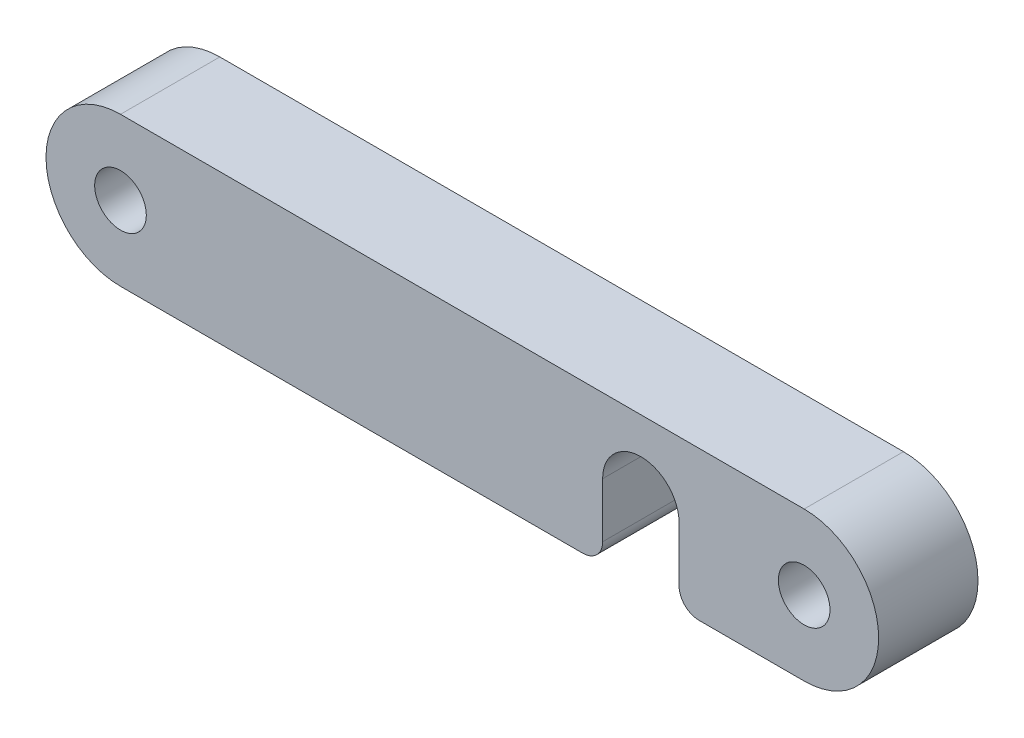
ISO-10303-21;
HEADER;
FILE_DESCRIPTION(('STEP AP214'),'2;1');
FILE_NAME('part.step','',(''),(''),'','','');
FILE_SCHEMA(('AUTOMOTIVE_DESIGN { 1 0 10303 214 1 1 1 1 }'));
ENDSEC;
DATA;
#1=APPLICATION_CONTEXT('core data for automotive mechanical design processes');
#2=APPLICATION_PROTOCOL_DEFINITION('international standard','automotive_design',2000,#1);
#3=PRODUCT_CONTEXT('',#1,'mechanical');
#4=PRODUCT('Part','Part','',(#3));
#5=PRODUCT_RELATED_PRODUCT_CATEGORY('part','',(#4));
#6=PRODUCT_DEFINITION_FORMATION('','',#4);
#7=PRODUCT_DEFINITION_CONTEXT('part definition',#1,'design');
#8=PRODUCT_DEFINITION('design','',#6,#7);
#9=PRODUCT_DEFINITION_SHAPE('','',#8);
#10=(LENGTH_UNIT() NAMED_UNIT(*) SI_UNIT(.MILLI.,.METRE.));
#11=(NAMED_UNIT(*) PLANE_ANGLE_UNIT() SI_UNIT($,.RADIAN.));
#12=(NAMED_UNIT(*) SI_UNIT($,.STERADIAN.) SOLID_ANGLE_UNIT());
#13=UNCERTAINTY_MEASURE_WITH_UNIT(LENGTH_MEASURE(1.E-05),#10,'distance_accuracy_value','');
#14=(GEOMETRIC_REPRESENTATION_CONTEXT(3) GLOBAL_UNCERTAINTY_ASSIGNED_CONTEXT((#13)) GLOBAL_UNIT_ASSIGNED_CONTEXT((#10,
#11,#12)) REPRESENTATION_CONTEXT('',''));
#15=CARTESIAN_POINT('',(0.,0.,0.));
#16=DIRECTION('',(0.,0.,1.));
#17=DIRECTION('',(1.,0.,0.));
#18=AXIS2_PLACEMENT_3D('',#15,#16,#17);
#19=CARTESIAN_POINT('',(-21.851501763,-4.7625,6.35));
#20=DIRECTION('',(0.,1.,0.));
#21=DIRECTION('',(0.,0.,1.));
#22=AXIS2_PLACEMENT_3D('',#19,#20,#21);
#23=PLANE('',#22);
#24=DIRECTION('',(0.,0.,-1.));
#25=VECTOR('',#24,1.);
#26=CARTESIAN_POINT('',(15.1269520910022,-4.7625,6.35));
#27=LINE('',#26,#25);
#28=CARTESIAN_POINT('',(15.1269520910022,-4.7625,6.35));
#29=VERTEX_POINT('',#28);
#30=CARTESIAN_POINT('',(15.1269520910022,-4.7625,0.));
#31=VERTEX_POINT('',#30);
#32=EDGE_CURVE('E164',#29,#31,#27,.T.);
#33=ORIENTED_EDGE('',*,*,#32,.T.);
#34=DIRECTION('',(1.,0.,0.));
#35=VECTOR('',#34,1.);
#36=CARTESIAN_POINT('',(-21.851501763,-4.7625,0.));
#37=LINE('',#36,#35);
#38=CARTESIAN_POINT('',(21.851501763,-4.7625,0.));
#39=VERTEX_POINT('',#38);
#40=EDGE_CURVE('E193',#31,#39,#37,.T.);
#41=ORIENTED_EDGE('',*,*,#40,.T.);
#42=DIRECTION('',(0.,0.,-1.));
#43=VECTOR('',#42,1.);
#44=CARTESIAN_POINT('',(21.851501763,-4.7625,6.35));
#45=LINE('',#44,#43);
#46=CARTESIAN_POINT('',(21.851501763,-4.7625,6.35));
#47=VERTEX_POINT('',#46);
#48=EDGE_CURVE('E43',#47,#39,#45,.T.);
#49=ORIENTED_EDGE('',*,*,#48,.F.);
#50=DIRECTION('',(1.,0.,0.));
#51=VECTOR('',#50,1.);
#52=CARTESIAN_POINT('',(-21.851501763,-4.7625,6.35));
#53=LINE('',#52,#51);
#54=EDGE_CURVE('E185',#29,#47,#53,.T.);
#55=ORIENTED_EDGE('',*,*,#54,.F.);
#56=EDGE_LOOP('',(#33,#41,#49,#55));
#57=FACE_BOUND('',#56,.T.);
#58=ADVANCED_FACE('F35',(#57),#23,.F.);
#59=CARTESIAN_POINT('',(-21.851501763,0.,6.35));
#60=DIRECTION('',(0.,0.,1.));
#61=DIRECTION('',(1.,0.,0.));
#62=AXIS2_PLACEMENT_3D('',#59,#60,#61);
#63=PLANE('',#62);
#64=CARTESIAN_POINT('',(7.69945209100216,-3.4925,6.35));
#65=DIRECTION('',(0.,0.,1.));
#66=DIRECTION('',(-1.,0.,0.));
#67=AXIS2_PLACEMENT_3D('',#64,#65,#66);
#68=CIRCLE('',#67,1.27);
#69=CARTESIAN_POINT('',(7.69945209100216,-4.7625,6.35));
#70=VERTEX_POINT('',#69);
#71=CARTESIAN_POINT('',(8.96945209100216,-3.4925,6.35));
#72=VERTEX_POINT('',#71);
#73=EDGE_CURVE('E125',#70,#72,#68,.T.);
#74=ORIENTED_EDGE('',*,*,#73,.T.);
#75=DIRECTION('',(0.,1.,0.));
#76=VECTOR('',#75,1.);
#77=CARTESIAN_POINT('',(8.96945209100216,-1.42681005899092E-13,6.35));
#78=LINE('',#77,#76);
#79=CARTESIAN_POINT('',(8.96945209100216,-1.42681005899092E-13,6.35));
#80=VERTEX_POINT('',#79);
#81=EDGE_CURVE('E135',#72,#80,#78,.T.);
#82=ORIENTED_EDGE('',*,*,#81,.T.);
#83=CARTESIAN_POINT('',(11.4132020910022,-1.42681005899092E-13,6.35));
#84=DIRECTION('',(0.,0.,-1.));
#85=DIRECTION('',(-1.,0.,0.));
#86=AXIS2_PLACEMENT_3D('',#83,#84,#85);
#87=CIRCLE('',#86,2.44375);
#88=CARTESIAN_POINT('',(13.8569520910022,-1.42381732837551E-13,6.35));
#89=VERTEX_POINT('',#88);
#90=EDGE_CURVE('E139',#80,#89,#87,.T.);
#91=ORIENTED_EDGE('',*,*,#90,.T.);
#92=DIRECTION('',(0.,-1.,0.));
#93=VECTOR('',#92,1.);
#94=CARTESIAN_POINT('',(13.8569520910022,-3.4925,6.35));
#95=LINE('',#94,#93);
#96=CARTESIAN_POINT('',(13.8569520910022,-3.4925,6.35));
#97=VERTEX_POINT('',#96);
#98=EDGE_CURVE('E148',#89,#97,#95,.T.);
#99=ORIENTED_EDGE('',*,*,#98,.T.);
#100=CARTESIAN_POINT('',(15.1269520910022,-3.4925,6.35));
#101=DIRECTION('',(0.,0.,1.));
#102=DIRECTION('',(-1.,0.,0.));
#103=AXIS2_PLACEMENT_3D('',#100,#101,#102);
#104=CIRCLE('',#103,1.27);
#105=EDGE_CURVE('E132',#97,#29,#104,.T.);
#106=ORIENTED_EDGE('',*,*,#105,.T.);
#107=ORIENTED_EDGE('',*,*,#54,.T.);
#108=CARTESIAN_POINT('',(21.851501763,0.,6.35));
#109=DIRECTION('',(0.,0.,1.));
#110=DIRECTION('',(1.,0.,0.));
#111=AXIS2_PLACEMENT_3D('',#108,#109,#110);
#112=CIRCLE('',#111,4.7625);
#113=CARTESIAN_POINT('',(21.851501763,4.7625,6.35));
#114=VERTEX_POINT('',#113);
#115=EDGE_CURVE('E187',#47,#114,#112,.T.);
#116=ORIENTED_EDGE('',*,*,#115,.T.);
#117=DIRECTION('',(-1.,0.,0.));
#118=VECTOR('',#117,1.);
#119=CARTESIAN_POINT('',(-21.851501763,4.7625,6.35));
#120=LINE('',#119,#118);
#121=CARTESIAN_POINT('',(-21.851501763,4.7625,6.35));
#122=VERTEX_POINT('',#121);
#123=EDGE_CURVE('E59',#114,#122,#120,.T.);
#124=ORIENTED_EDGE('',*,*,#123,.T.);
#125=CARTESIAN_POINT('',(-21.851501763,0.,6.35));
#126=DIRECTION('',(0.,0.,1.));
#127=DIRECTION('',(1.,0.,0.));
#128=AXIS2_PLACEMENT_3D('',#125,#126,#127);
#129=CIRCLE('',#128,4.7625);
#130=CARTESIAN_POINT('',(-21.851501763,-4.7625,6.35));
#131=VERTEX_POINT('',#130);
#132=EDGE_CURVE('E183',#122,#131,#129,.T.);
#133=ORIENTED_EDGE('',*,*,#132,.T.);
#134=EDGE_CURVE('E87',#131,#70,#53,.T.);
#135=ORIENTED_EDGE('',*,*,#134,.T.);
#136=EDGE_LOOP('',(#74,#82,#91,#99,#106,#107,#116,#124,#133,#135));
#137=FACE_BOUND('',#136,.T.);
#138=CARTESIAN_POINT('',(21.851501763,0.,6.35));
#139=DIRECTION('',(0.,0.,1.));
#140=DIRECTION('',(1.,0.,0.));
#141=AXIS2_PLACEMENT_3D('',#138,#139,#140);
#142=CIRCLE('',#141,1.65);
#143=CARTESIAN_POINT('',(23.501501763,0.,6.35));
#144=VERTEX_POINT('',#143);
#145=EDGE_CURVE('E177',#144,#144,#142,.T.);
#146=ORIENTED_EDGE('',*,*,#145,.F.);
#147=EDGE_LOOP('',(#146));
#148=FACE_BOUND('',#147,.T.);
#149=CARTESIAN_POINT('',(-21.851501763,0.,6.35));
#150=DIRECTION('',(0.,0.,1.));
#151=DIRECTION('',(1.,0.,0.));
#152=AXIS2_PLACEMENT_3D('',#149,#150,#151);
#153=CIRCLE('',#152,1.65);
#154=CARTESIAN_POINT('',(-20.201501763,0.,6.35));
#155=VERTEX_POINT('',#154);
#156=EDGE_CURVE('E171',#155,#155,#153,.T.);
#157=ORIENTED_EDGE('',*,*,#156,.F.);
#158=EDGE_LOOP('',(#157));
#159=FACE_BOUND('',#158,.T.);
#160=ADVANCED_FACE('F141',(#137,#148,#159),#63,.T.);
#161=CARTESIAN_POINT('',(-21.851501763,0.,0.));
#162=DIRECTION('',(0.,0.,1.));
#163=DIRECTION('',(1.,0.,0.));
#164=AXIS2_PLACEMENT_3D('',#161,#162,#163);
#165=PLANE('',#164);
#166=DIRECTION('',(0.,1.,0.));
#167=VECTOR('',#166,1.);
#168=CARTESIAN_POINT('',(8.96945209100216,-1.42681005899092E-13,0.));
#169=LINE('',#168,#167);
#170=CARTESIAN_POINT('',(8.96945209100216,-3.4925,0.));
#171=VERTEX_POINT('',#170);
#172=CARTESIAN_POINT('',(8.96945209100216,-1.42681005899092E-13,0.));
#173=VERTEX_POINT('',#172);
#174=EDGE_CURVE('E154',#171,#173,#169,.T.);
#175=ORIENTED_EDGE('',*,*,#174,.F.);
#176=CARTESIAN_POINT('',(7.69945209100216,-3.4925,0.));
#177=DIRECTION('',(0.,0.,1.));
#178=DIRECTION('',(-1.,0.,0.));
#179=AXIS2_PLACEMENT_3D('',#176,#177,#178);
#180=CIRCLE('',#179,1.27);
#181=CARTESIAN_POINT('',(7.69945209100216,-4.7625,0.));
#182=VERTEX_POINT('',#181);
#183=EDGE_CURVE('E127',#182,#171,#180,.T.);
#184=ORIENTED_EDGE('',*,*,#183,.F.);
#185=CARTESIAN_POINT('',(-21.851501763,-4.7625,0.));
#186=VERTEX_POINT('',#185);
#187=EDGE_CURVE('E194',#186,#182,#37,.T.);
#188=ORIENTED_EDGE('',*,*,#187,.F.);
#189=CARTESIAN_POINT('',(-21.851501763,0.,0.));
#190=DIRECTION('',(0.,0.,1.));
#191=DIRECTION('',(1.,0.,0.));
#192=AXIS2_PLACEMENT_3D('',#189,#190,#191);
#193=CIRCLE('',#192,4.7625);
#194=CARTESIAN_POINT('',(-21.851501763,4.7625,0.));
#195=VERTEX_POINT('',#194);
#196=EDGE_CURVE('E180',#195,#186,#193,.T.);
#197=ORIENTED_EDGE('',*,*,#196,.F.);
#198=DIRECTION('',(-1.,0.,0.));
#199=VECTOR('',#198,1.);
#200=CARTESIAN_POINT('',(-21.851501763,4.7625,0.));
#201=LINE('',#200,#199);
#202=CARTESIAN_POINT('',(21.851501763,4.7625,0.));
#203=VERTEX_POINT('',#202);
#204=EDGE_CURVE('E80',#203,#195,#201,.T.);
#205=ORIENTED_EDGE('',*,*,#204,.F.);
#206=CARTESIAN_POINT('',(21.851501763,0.,0.));
#207=DIRECTION('',(0.,0.,1.));
#208=DIRECTION('',(1.,0.,0.));
#209=AXIS2_PLACEMENT_3D('',#206,#207,#208);
#210=CIRCLE('',#209,4.7625);
#211=EDGE_CURVE('E197',#39,#203,#210,.T.);
#212=ORIENTED_EDGE('',*,*,#211,.F.);
#213=ORIENTED_EDGE('',*,*,#40,.F.);
#214=CARTESIAN_POINT('',(15.1269520910022,-3.4925,0.));
#215=DIRECTION('',(0.,0.,1.));
#216=DIRECTION('',(-1.,0.,0.));
#217=AXIS2_PLACEMENT_3D('',#214,#215,#216);
#218=CIRCLE('',#217,1.27);
#219=CARTESIAN_POINT('',(13.8569520910022,-3.4925,0.));
#220=VERTEX_POINT('',#219);
#221=EDGE_CURVE('E50',#220,#31,#218,.T.);
#222=ORIENTED_EDGE('',*,*,#221,.F.);
#223=DIRECTION('',(0.,-1.,0.));
#224=VECTOR('',#223,1.);
#225=CARTESIAN_POINT('',(13.8569520910022,-3.4925,0.));
#226=LINE('',#225,#224);
#227=CARTESIAN_POINT('',(13.8569520910022,-1.42381732837551E-13,0.));
#228=VERTEX_POINT('',#227);
#229=EDGE_CURVE('E144',#228,#220,#226,.T.);
#230=ORIENTED_EDGE('',*,*,#229,.F.);
#231=CARTESIAN_POINT('',(11.4132020910022,-1.42681005899092E-13,0.));
#232=DIRECTION('',(0.,0.,-1.));
#233=DIRECTION('',(-1.,0.,0.));
#234=AXIS2_PLACEMENT_3D('',#231,#232,#233);
#235=CIRCLE('',#234,2.44375);
#236=EDGE_CURVE('E156',#173,#228,#235,.T.);
#237=ORIENTED_EDGE('',*,*,#236,.F.);
#238=EDGE_LOOP('',(#175,#184,#188,#197,#205,#212,#213,#222,#230,#237));
#239=FACE_BOUND('',#238,.T.);
#240=CARTESIAN_POINT('',(21.851501763,0.,0.));
#241=DIRECTION('',(0.,0.,1.));
#242=DIRECTION('',(1.,0.,0.));
#243=AXIS2_PLACEMENT_3D('',#240,#241,#242);
#244=CIRCLE('',#243,1.65);
#245=CARTESIAN_POINT('',(23.501501763,0.,0.));
#246=VERTEX_POINT('',#245);
#247=EDGE_CURVE('E174',#246,#246,#244,.T.);
#248=ORIENTED_EDGE('',*,*,#247,.T.);
#249=EDGE_LOOP('',(#248));
#250=FACE_BOUND('',#249,.T.);
#251=CARTESIAN_POINT('',(-21.851501763,0.,0.));
#252=DIRECTION('',(0.,0.,1.));
#253=DIRECTION('',(1.,0.,0.));
#254=AXIS2_PLACEMENT_3D('',#251,#252,#253);
#255=CIRCLE('',#254,1.65);
#256=CARTESIAN_POINT('',(-20.201501763,0.,0.));
#257=VERTEX_POINT('',#256);
#258=EDGE_CURVE('E163',#257,#257,#255,.T.);
#259=ORIENTED_EDGE('',*,*,#258,.T.);
#260=EDGE_LOOP('',(#259));
#261=FACE_BOUND('',#260,.T.);
#262=ADVANCED_FACE('F213',(#239,#250,#261),#165,.F.);
#263=CARTESIAN_POINT('',(-21.851501763,0.,6.35));
#264=DIRECTION('',(0.,0.,-1.));
#265=DIRECTION('',(-1.,0.,0.));
#266=AXIS2_PLACEMENT_3D('',#263,#264,#265);
#267=CYLINDRICAL_SURFACE('',#266,4.7625);
#268=ORIENTED_EDGE('',*,*,#196,.T.);
#269=DIRECTION('',(0.,0.,-1.));
#270=VECTOR('',#269,1.);
#271=CARTESIAN_POINT('',(-21.851501763,-4.7625,6.35));
#272=LINE('',#271,#270);
#273=EDGE_CURVE('E11',#131,#186,#272,.T.);
#274=ORIENTED_EDGE('',*,*,#273,.F.);
#275=ORIENTED_EDGE('',*,*,#132,.F.);
#276=DIRECTION('',(0.,0.,-1.));
#277=VECTOR('',#276,1.);
#278=CARTESIAN_POINT('',(-21.851501763,4.7625,6.35));
#279=LINE('',#278,#277);
#280=EDGE_CURVE('E190',#122,#195,#279,.T.);
#281=ORIENTED_EDGE('',*,*,#280,.T.);
#282=EDGE_LOOP('',(#268,#274,#275,#281));
#283=FACE_BOUND('',#282,.T.);
#284=ADVANCED_FACE('F37',(#283),#267,.T.);
#285=ORIENTED_EDGE('',*,*,#187,.T.);
#286=DIRECTION('',(0.,0.,-1.));
#287=VECTOR('',#286,1.);
#288=CARTESIAN_POINT('',(7.69945209100216,-4.7625,6.35));
#289=LINE('',#288,#287);
#290=EDGE_CURVE('E161',#70,#182,#289,.T.);
#291=ORIENTED_EDGE('',*,*,#290,.F.);
#292=ORIENTED_EDGE('',*,*,#134,.F.);
#293=ORIENTED_EDGE('',*,*,#273,.T.);
#294=EDGE_LOOP('',(#285,#291,#292,#293));
#295=FACE_BOUND('',#294,.T.);
#296=ADVANCED_FACE('F230',(#295),#23,.F.);
#297=CARTESIAN_POINT('',(21.851501763,0.,6.35));
#298=DIRECTION('',(0.,0.,-1.));
#299=DIRECTION('',(-1.,0.,0.));
#300=AXIS2_PLACEMENT_3D('',#297,#298,#299);
#301=CYLINDRICAL_SURFACE('',#300,4.7625);
#302=ORIENTED_EDGE('',*,*,#211,.T.);
#303=DIRECTION('',(0.,0.,-1.));
#304=VECTOR('',#303,1.);
#305=CARTESIAN_POINT('',(21.851501763,4.7625,6.35));
#306=LINE('',#305,#304);
#307=EDGE_CURVE('E201',#114,#203,#306,.T.);
#308=ORIENTED_EDGE('',*,*,#307,.F.);
#309=ORIENTED_EDGE('',*,*,#115,.F.);
#310=ORIENTED_EDGE('',*,*,#48,.T.);
#311=EDGE_LOOP('',(#302,#308,#309,#310));
#312=FACE_BOUND('',#311,.T.);
#313=ADVANCED_FACE('F207',(#312),#301,.T.);
#314=CARTESIAN_POINT('',(-21.851501763,4.7625,6.35));
#315=DIRECTION('',(0.,-1.,0.));
#316=DIRECTION('',(0.,0.,-1.));
#317=AXIS2_PLACEMENT_3D('',#314,#315,#316);
#318=PLANE('',#317);
#319=ORIENTED_EDGE('',*,*,#204,.T.);
#320=ORIENTED_EDGE('',*,*,#280,.F.);
#321=ORIENTED_EDGE('',*,*,#123,.F.);
#322=ORIENTED_EDGE('',*,*,#307,.T.);
#323=EDGE_LOOP('',(#319,#320,#321,#322));
#324=FACE_BOUND('',#323,.T.);
#325=ADVANCED_FACE('F219',(#324),#318,.F.);
#326=CARTESIAN_POINT('',(21.851501763,0.,6.35));
#327=DIRECTION('',(0.,0.,-1.));
#328=DIRECTION('',(-1.,0.,0.));
#329=AXIS2_PLACEMENT_3D('',#326,#327,#328);
#330=CYLINDRICAL_SURFACE('',#329,1.65);
#331=ORIENTED_EDGE('',*,*,#145,.T.);
#332=EDGE_LOOP('',(#331));
#333=FACE_BOUND('',#332,.T.);
#334=ORIENTED_EDGE('',*,*,#247,.F.);
#335=EDGE_LOOP('',(#334));
#336=FACE_BOUND('',#335,.T.);
#337=ADVANCED_FACE('F221',(#333,#336),#330,.F.);
#338=CARTESIAN_POINT('',(-21.851501763,0.,6.35));
#339=DIRECTION('',(0.,0.,-1.));
#340=DIRECTION('',(-1.,0.,0.));
#341=AXIS2_PLACEMENT_3D('',#338,#339,#340);
#342=CYLINDRICAL_SURFACE('',#341,1.65);
#343=ORIENTED_EDGE('',*,*,#156,.T.);
#344=EDGE_LOOP('',(#343));
#345=FACE_BOUND('',#344,.T.);
#346=ORIENTED_EDGE('',*,*,#258,.F.);
#347=EDGE_LOOP('',(#346));
#348=FACE_BOUND('',#347,.T.);
#349=ADVANCED_FACE('F227',(#345,#348),#342,.F.);
#350=CARTESIAN_POINT('',(7.69945209100216,-3.4925,6.35));
#351=DIRECTION('',(0.,0.,-1.));
#352=DIRECTION('',(-1.,0.,0.));
#353=AXIS2_PLACEMENT_3D('',#350,#351,#352);
#354=CYLINDRICAL_SURFACE('',#353,1.27);
#355=ORIENTED_EDGE('',*,*,#183,.T.);
#356=DIRECTION('',(0.,0.,-1.));
#357=VECTOR('',#356,1.);
#358=CARTESIAN_POINT('',(8.96945209100216,-3.4925,6.35));
#359=LINE('',#358,#357);
#360=EDGE_CURVE('E121',#72,#171,#359,.T.);
#361=ORIENTED_EDGE('',*,*,#360,.F.);
#362=ORIENTED_EDGE('',*,*,#73,.F.);
#363=ORIENTED_EDGE('',*,*,#290,.T.);
#364=EDGE_LOOP('',(#355,#361,#362,#363));
#365=FACE_BOUND('',#364,.T.);
#366=ADVANCED_FACE('F123',(#365),#354,.T.);
#367=CARTESIAN_POINT('',(15.1269520910022,-3.4925,6.35));
#368=DIRECTION('',(0.,0.,-1.));
#369=DIRECTION('',(-1.,0.,0.));
#370=AXIS2_PLACEMENT_3D('',#367,#368,#369);
#371=CYLINDRICAL_SURFACE('',#370,1.27);
#372=ORIENTED_EDGE('',*,*,#221,.T.);
#373=ORIENTED_EDGE('',*,*,#32,.F.);
#374=ORIENTED_EDGE('',*,*,#105,.F.);
#375=DIRECTION('',(0.,0.,-1.));
#376=VECTOR('',#375,1.);
#377=CARTESIAN_POINT('',(13.8569520910022,-3.4925,6.35));
#378=LINE('',#377,#376);
#379=EDGE_CURVE('E166',#97,#220,#378,.T.);
#380=ORIENTED_EDGE('',*,*,#379,.T.);
#381=EDGE_LOOP('',(#372,#373,#374,#380));
#382=FACE_BOUND('',#381,.T.);
#383=ADVANCED_FACE('F250',(#382),#371,.T.);
#384=CARTESIAN_POINT('',(13.8569520910022,-3.4925,6.35));
#385=DIRECTION('',(1.,0.,0.));
#386=DIRECTION('',(0.,0.,-1.));
#387=AXIS2_PLACEMENT_3D('',#384,#385,#386);
#388=PLANE('',#387);
#389=ORIENTED_EDGE('',*,*,#229,.T.);
#390=ORIENTED_EDGE('',*,*,#379,.F.);
#391=ORIENTED_EDGE('',*,*,#98,.F.);
#392=DIRECTION('',(0.,0.,-1.));
#393=VECTOR('',#392,1.);
#394=CARTESIAN_POINT('',(13.8569520910022,-1.42381732837551E-13,6.35));
#395=LINE('',#394,#393);
#396=EDGE_CURVE('E168',#89,#228,#395,.T.);
#397=ORIENTED_EDGE('',*,*,#396,.T.);
#398=EDGE_LOOP('',(#389,#390,#391,#397));
#399=FACE_BOUND('',#398,.T.);
#400=ADVANCED_FACE('F249',(#399),#388,.F.);
#401=CARTESIAN_POINT('',(11.4132020910022,-1.42681005899092E-13,6.35));
#402=DIRECTION('',(0.,0.,-1.));
#403=DIRECTION('',(-1.,0.,0.));
#404=AXIS2_PLACEMENT_3D('',#401,#402,#403);
#405=CYLINDRICAL_SURFACE('',#404,2.44375);
#406=ORIENTED_EDGE('',*,*,#236,.T.);
#407=ORIENTED_EDGE('',*,*,#396,.F.);
#408=ORIENTED_EDGE('',*,*,#90,.F.);
#409=DIRECTION('',(0.,0.,-1.));
#410=VECTOR('',#409,1.);
#411=CARTESIAN_POINT('',(8.96945209100216,-1.42681005899092E-13,6.35));
#412=LINE('',#411,#410);
#413=EDGE_CURVE('E131',#80,#173,#412,.T.);
#414=ORIENTED_EDGE('',*,*,#413,.T.);
#415=EDGE_LOOP('',(#406,#407,#408,#414));
#416=FACE_BOUND('',#415,.T.);
#417=ADVANCED_FACE('F245',(#416),#405,.F.);
#418=CARTESIAN_POINT('',(8.96945209100216,-1.42681005899092E-13,6.35));
#419=DIRECTION('',(-1.,0.,0.));
#420=DIRECTION('',(0.,0.,1.));
#421=AXIS2_PLACEMENT_3D('',#418,#419,#420);
#422=PLANE('',#421);
#423=ORIENTED_EDGE('',*,*,#174,.T.);
#424=ORIENTED_EDGE('',*,*,#413,.F.);
#425=ORIENTED_EDGE('',*,*,#81,.F.);
#426=ORIENTED_EDGE('',*,*,#360,.T.);
#427=EDGE_LOOP('',(#423,#424,#425,#426));
#428=FACE_BOUND('',#427,.T.);
#429=ADVANCED_FACE('F136',(#428),#422,.F.);
#430=CLOSED_SHELL('',(#58,#160,#262,#284,#296,#313,#325,#337,#349,#366,#383,#400,#417,#429));
#431=MANIFOLD_SOLID_BREP('B2',#430);
#432=ADVANCED_BREP_SHAPE_REPRESENTATION('',(#18,#431),#14);
#433=SHAPE_DEFINITION_REPRESENTATION(#9,#432);
ENDSEC;
END-ISO-10303-21;
